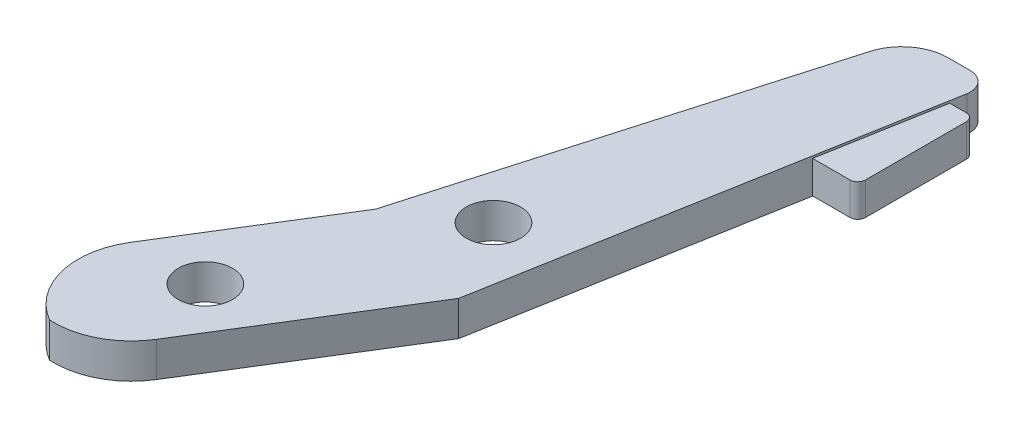
ISO-10303-21;
HEADER;
FILE_DESCRIPTION(('STEP AP214'),'2;1');
FILE_NAME('part.step','',(''),(''),'','','');
FILE_SCHEMA(('AUTOMOTIVE_DESIGN { 1 0 10303 214 1 1 1 1 }'));
ENDSEC;
DATA;
#1=APPLICATION_CONTEXT('core data for automotive mechanical design processes');
#2=APPLICATION_PROTOCOL_DEFINITION('international standard','automotive_design',2000,#1);
#3=PRODUCT_CONTEXT('',#1,'mechanical');
#4=PRODUCT('Part','Part','',(#3));
#5=PRODUCT_RELATED_PRODUCT_CATEGORY('part','',(#4));
#6=PRODUCT_DEFINITION_FORMATION('','',#4);
#7=PRODUCT_DEFINITION_CONTEXT('part definition',#1,'design');
#8=PRODUCT_DEFINITION('design','',#6,#7);
#9=PRODUCT_DEFINITION_SHAPE('','',#8);
#10=(LENGTH_UNIT() NAMED_UNIT(*) SI_UNIT(.MILLI.,.METRE.));
#11=(NAMED_UNIT(*) PLANE_ANGLE_UNIT() SI_UNIT($,.RADIAN.));
#12=(NAMED_UNIT(*) SI_UNIT($,.STERADIAN.) SOLID_ANGLE_UNIT());
#13=UNCERTAINTY_MEASURE_WITH_UNIT(LENGTH_MEASURE(1.E-05),#10,'distance_accuracy_value','');
#14=(GEOMETRIC_REPRESENTATION_CONTEXT(3) GLOBAL_UNCERTAINTY_ASSIGNED_CONTEXT((#13)) GLOBAL_UNIT_ASSIGNED_CONTEXT((#10,
#11,#12)) REPRESENTATION_CONTEXT('',''));
#15=CARTESIAN_POINT('',(0.,0.,0.));
#16=DIRECTION('',(0.,0.,1.));
#17=DIRECTION('',(1.,0.,0.));
#18=AXIS2_PLACEMENT_3D('',#15,#16,#17);
#19=CARTESIAN_POINT('',(17.140904696747,2.25,-12.9920484404567));
#20=DIRECTION('',(-0.85003009663462,0.,-0.526734121559767));
#21=DIRECTION('',(-0.526734121559767,0.,0.85003009663462));
#22=AXIS2_PLACEMENT_3D('',#19,#20,#21);
#23=PLANE('',#22);
#24=DIRECTION('',(0.526734121559767,0.,-0.85003009663462));
#25=VECTOR('',#24,1.);
#26=CARTESIAN_POINT('',(17.140904696747,2.25,-12.9920484404567));
#27=LINE('',#26,#25);
#28=CARTESIAN_POINT('',(9.68009535494014,2.25,-0.951984533055313));
#29=VERTEX_POINT('',#28);
#30=CARTESIAN_POINT('',(17.140904696747,2.25,-12.9920484404567));
#31=VERTEX_POINT('',#30);
#32=EDGE_CURVE('E182',#29,#31,#27,.T.);
#33=ORIENTED_EDGE('',*,*,#32,.F.);
#34=DIRECTION('',(0.,-1.,0.));
#35=VECTOR('',#34,1.);
#36=CARTESIAN_POINT('',(9.68009535494014,2.25,-0.951984533055313));
#37=LINE('',#36,#35);
#38=CARTESIAN_POINT('',(9.68009535494014,0.,-0.951984533055313));
#39=VERTEX_POINT('',#38);
#40=EDGE_CURVE('E212',#29,#39,#37,.T.);
#41=ORIENTED_EDGE('',*,*,#40,.T.);
#42=DIRECTION('',(0.526734121559767,0.,-0.85003009663462));
#43=VECTOR('',#42,1.);
#44=CARTESIAN_POINT('',(17.140904696747,0.,-12.9920484404567));
#45=LINE('',#44,#43);
#46=CARTESIAN_POINT('',(17.140904696747,0.,-12.9920484404567));
#47=VERTEX_POINT('',#46);
#48=EDGE_CURVE('E196',#39,#47,#45,.T.);
#49=ORIENTED_EDGE('',*,*,#48,.T.);
#50=DIRECTION('',(0.,-1.,0.));
#51=VECTOR('',#50,1.);
#52=CARTESIAN_POINT('',(17.140904696747,2.25,-12.9920484404567));
#53=LINE('',#52,#51);
#54=EDGE_CURVE('E209',#31,#47,#53,.T.);
#55=ORIENTED_EDGE('',*,*,#54,.F.);
#56=EDGE_LOOP('',(#33,#41,#49,#55));
#57=FACE_BOUND('',#56,.T.);
#58=ADVANCED_FACE('F33',(#57),#23,.F.);
#59=CARTESIAN_POINT('',(17.140904696747,2.25,-12.9920484404567));
#60=DIRECTION('',(-0.984486689305696,0.,-0.175459278979224));
#61=DIRECTION('',(-0.175459278979224,0.,0.984486689305697));
#62=AXIS2_PLACEMENT_3D('',#59,#60,#61);
#63=PLANE('',#62);
#64=DIRECTION('',(0.,-1.,0.));
#65=VECTOR('',#64,1.);
#66=CARTESIAN_POINT('',(20.5928074284273,2.1072170473523,-32.3603731702058));
#67=LINE('',#66,#65);
#68=CARTESIAN_POINT('',(20.5928074284273,2.1072170473523,-32.3603731702058));
#69=VERTEX_POINT('',#68);
#70=CARTESIAN_POINT('',(20.5928074284273,0.0072170473523008,-32.3603731702058));
#71=VERTEX_POINT('',#70);
#72=EDGE_CURVE('E143',#69,#71,#67,.T.);
#73=ORIENTED_EDGE('',*,*,#72,.F.);
#74=DIRECTION('',(-0.175459278979224,0.,0.984486689305697));
#75=VECTOR('',#74,1.);
#76=CARTESIAN_POINT('',(21.6672487151904,2.1072170473523,-38.3889693858783));
#77=LINE('',#76,#75);
#78=CARTESIAN_POINT('',(21.9294883674781,2.1072170473523,-39.8603731702058));
#79=VERTEX_POINT('',#78);
#80=EDGE_CURVE('E146',#79,#69,#77,.T.);
#81=ORIENTED_EDGE('',*,*,#80,.F.);
#82=DIRECTION('',(0.,1.,0.));
#83=VECTOR('',#82,1.);
#84=CARTESIAN_POINT('',(21.9294883674781,2.10721704735231,-39.8603731702058));
#85=LINE('',#84,#83);
#86=CARTESIAN_POINT('',(21.9294883674781,0.00721704735230167,-39.8603731702058));
#87=VERTEX_POINT('',#86);
#88=EDGE_CURVE('E166',#87,#79,#85,.T.);
#89=ORIENTED_EDGE('',*,*,#88,.F.);
#90=DIRECTION('',(0.175459278979224,0.,-0.984486689305697));
#91=VECTOR('',#90,1.);
#92=CARTESIAN_POINT('',(21.6672487151904,0.0072170473523015,-38.3889693858783));
#93=LINE('',#92,#91);
#94=EDGE_CURVE('E157',#71,#87,#93,.T.);
#95=ORIENTED_EDGE('',*,*,#94,.F.);
#96=EDGE_LOOP('',(#73,#81,#89,#95));
#97=FACE_BOUND('',#96,.T.);
#98=DIRECTION('',(0.175459278979224,0.,-0.984486689305696));
#99=VECTOR('',#98,1.);
#100=CARTESIAN_POINT('',(17.140904696747,0.,-12.9920484404567));
#101=LINE('',#100,#99);
#102=CARTESIAN_POINT('',(22.0960952188587,0.,-40.7951896614485));
#103=VERTEX_POINT('',#102);
#104=EDGE_CURVE('E198',#47,#103,#101,.T.);
#105=ORIENTED_EDGE('',*,*,#104,.T.);
#106=DIRECTION('',(0.,-1.,0.));
#107=VECTOR('',#106,1.);
#108=CARTESIAN_POINT('',(22.0960952188587,2.25,-40.7951896614485));
#109=LINE('',#108,#107);
#110=CARTESIAN_POINT('',(22.0960952188587,2.25,-40.7951896614485));
#111=VERTEX_POINT('',#110);
#112=EDGE_CURVE('E243',#103,#111,#109,.F.);
#113=ORIENTED_EDGE('',*,*,#112,.T.);
#114=DIRECTION('',(0.175459278979224,0.,-0.984486689305696));
#115=VECTOR('',#114,1.);
#116=CARTESIAN_POINT('',(17.140904696747,2.25,-12.9920484404567));
#117=LINE('',#116,#115);
#118=EDGE_CURVE('E184',#31,#111,#117,.T.);
#119=ORIENTED_EDGE('',*,*,#118,.F.);
#120=ORIENTED_EDGE('',*,*,#54,.T.);
#121=EDGE_LOOP('',(#105,#113,#119,#120));
#122=FACE_BOUND('',#121,.T.);
#123=ADVANCED_FACE('F155',(#97,#122),#63,.F.);
#124=CARTESIAN_POINT('',(22.3474894609134,2.25,-42.2057407962235));
#125=DIRECTION('',(0.,0.,1.));
#126=DIRECTION('',(1.,0.,0.));
#127=AXIS2_PLACEMENT_3D('',#124,#125,#126);
#128=PLANE('',#127);
#129=DIRECTION('',(-1.,0.,0.));
#130=VECTOR('',#129,1.);
#131=CARTESIAN_POINT('',(22.3474894609134,2.25,-42.2057407962235));
#132=LINE('',#131,#130);
#133=CARTESIAN_POINT('',(20.9147111916919,2.25,-42.2057407962235));
#134=VERTEX_POINT('',#133);
#135=CARTESIAN_POINT('',(19.4918794899271,2.25,-42.2057407962235));
#136=VERTEX_POINT('',#135);
#137=EDGE_CURVE('E188',#134,#136,#132,.T.);
#138=ORIENTED_EDGE('',*,*,#137,.F.);
#139=DIRECTION('',(0.,-1.,0.));
#140=VECTOR('',#139,1.);
#141=CARTESIAN_POINT('',(20.9147111916919,2.25,-42.2057407962235));
#142=LINE('',#141,#140);
#143=CARTESIAN_POINT('',(20.9147111916919,0.,-42.2057407962235));
#144=VERTEX_POINT('',#143);
#145=EDGE_CURVE('E238',#134,#144,#142,.T.);
#146=ORIENTED_EDGE('',*,*,#145,.T.);
#147=DIRECTION('',(-1.,0.,0.));
#148=VECTOR('',#147,1.);
#149=CARTESIAN_POINT('',(22.3474894609134,0.,-42.2057407962235));
#150=LINE('',#149,#148);
#151=CARTESIAN_POINT('',(19.4918794899271,0.,-42.2057407962235));
#152=VERTEX_POINT('',#151);
#153=EDGE_CURVE('E201',#144,#152,#150,.T.);
#154=ORIENTED_EDGE('',*,*,#153,.T.);
#155=DIRECTION('',(0.,-1.,0.));
#156=VECTOR('',#155,1.);
#157=CARTESIAN_POINT('',(19.4918794899271,2.25,-42.2057407962235));
#158=LINE('',#157,#156);
#159=EDGE_CURVE('E233',#152,#136,#158,.F.);
#160=ORIENTED_EDGE('',*,*,#159,.T.);
#161=EDGE_LOOP('',(#138,#146,#154,#160));
#162=FACE_BOUND('',#161,.T.);
#163=ADVANCED_FACE('F289',(#162),#128,.F.);
#164=CARTESIAN_POINT('',(9.48121418807581,2.25,-15.3005417394231));
#165=DIRECTION('',(0.960899966314299,0.,0.276895747055058));
#166=DIRECTION('',(0.276895747055058,0.,-0.960899966314299));
#167=AXIS2_PLACEMENT_3D('',#164,#165,#166);
#168=PLANE('',#167);
#169=DIRECTION('',(-0.276895747055058,0.,0.960899966314299));
#170=VECTOR('',#169,1.);
#171=CARTESIAN_POINT('',(9.48121418807581,2.25,-15.3005417394231));
#172=LINE('',#171,#170);
#173=CARTESIAN_POINT('',(16.6091795909842,2.25,-40.0364280373887));
#174=VERTEX_POINT('',#173);
#175=CARTESIAN_POINT('',(9.48121418807581,2.25,-15.3005417394231));
#176=VERTEX_POINT('',#175);
#177=EDGE_CURVE('E190',#174,#176,#172,.T.);
#178=ORIENTED_EDGE('',*,*,#177,.F.);
#179=DIRECTION('',(0.,-1.,0.));
#180=VECTOR('',#179,1.);
#181=CARTESIAN_POINT('',(16.6091795909842,2.25,-40.0364280373887));
#182=LINE('',#181,#180);
#183=CARTESIAN_POINT('',(16.6091795909842,0.,-40.0364280373887));
#184=VERTEX_POINT('',#183);
#185=EDGE_CURVE('E225',#174,#184,#182,.T.);
#186=ORIENTED_EDGE('',*,*,#185,.T.);
#187=DIRECTION('',(-0.276895747055058,0.,0.960899966314299));
#188=VECTOR('',#187,1.);
#189=CARTESIAN_POINT('',(9.48121418807581,0.,-15.3005417394231));
#190=LINE('',#189,#188);
#191=CARTESIAN_POINT('',(9.48121418807581,0.,-15.3005417394231));
#192=VERTEX_POINT('',#191);
#193=EDGE_CURVE('E203',#184,#192,#190,.T.);
#194=ORIENTED_EDGE('',*,*,#193,.T.);
#195=DIRECTION('',(0.,-1.,0.));
#196=VECTOR('',#195,1.);
#197=CARTESIAN_POINT('',(9.48121418807581,2.25,-15.3005417394231));
#198=LINE('',#197,#196);
#199=EDGE_CURVE('E195',#176,#192,#198,.T.);
#200=ORIENTED_EDGE('',*,*,#199,.F.);
#201=EDGE_LOOP('',(#178,#186,#194,#200));
#202=FACE_BOUND('',#201,.T.);
#203=ADVANCED_FACE('F327',(#202),#168,.F.);
#204=CARTESIAN_POINT('',(0.,2.25,0.));
#205=DIRECTION('',(0.850030096634619,0.,0.526734121559767));
#206=DIRECTION('',(0.526734121559767,0.,-0.850030096634619));
#207=AXIS2_PLACEMENT_3D('',#204,#205,#206);
#208=PLANE('',#207);
#209=DIRECTION('',(-0.526734121559767,0.,0.850030096634619));
#210=VECTOR('',#209,1.);
#211=CARTESIAN_POINT('',(0.,0.,0.));
#212=LINE('',#211,#210);
#213=CARTESIAN_POINT('',(3.43308465290625,0.,-5.54022448863435));
#214=VERTEX_POINT('',#213);
#215=EDGE_CURVE('E185',#192,#214,#212,.T.);
#216=ORIENTED_EDGE('',*,*,#215,.T.);
#217=DIRECTION('',(0.,-1.,0.));
#218=VECTOR('',#217,1.);
#219=CARTESIAN_POINT('',(3.43308465290625,2.25,-5.54022448863435));
#220=LINE('',#219,#218);
#221=CARTESIAN_POINT('',(3.43308465290625,2.25,-5.54022448863435));
#222=VERTEX_POINT('',#221);
#223=EDGE_CURVE('E223',#214,#222,#220,.F.);
#224=ORIENTED_EDGE('',*,*,#223,.T.);
#225=DIRECTION('',(-0.526734121559767,0.,0.850030096634619));
#226=VECTOR('',#225,1.);
#227=CARTESIAN_POINT('',(0.,2.25,0.));
#228=LINE('',#227,#226);
#229=EDGE_CURVE('E192',#176,#222,#228,.T.);
#230=ORIENTED_EDGE('',*,*,#229,.F.);
#231=ORIENTED_EDGE('',*,*,#199,.T.);
#232=EDGE_LOOP('',(#216,#224,#230,#231));
#233=FACE_BOUND('',#232,.T.);
#234=ADVANCED_FACE('F332',(#233),#208,.F.);
#235=CARTESIAN_POINT('',(0.,2.25,0.));
#236=DIRECTION('',(0.,-1.,0.));
#237=DIRECTION('',(0.,0.,-1.));
#238=AXIS2_PLACEMENT_3D('',#235,#236,#237);
#239=PLANE('',#238);
#240=CARTESIAN_POINT('',(8.16721187147033,2.25,-5.62987306447002));
#241=DIRECTION('',(0.,1.,0.));
#242=DIRECTION('',(0.,0.,1.));
#243=AXIS2_PLACEMENT_3D('',#240,#241,#242);
#244=CIRCLE('',#243,1.75);
#245=CARTESIAN_POINT('',(8.16721187147033,2.25,-3.87987306447002));
#246=VERTEX_POINT('',#245);
#247=EDGE_CURVE('E174',#246,#246,#244,.T.);
#248=ORIENTED_EDGE('',*,*,#247,.F.);
#249=EDGE_LOOP('',(#248));
#250=FACE_BOUND('',#249,.T.);
#251=CARTESIAN_POINT('',(14.0314518235541,2.25,-18.3424923769636));
#252=DIRECTION('',(0.,1.,0.));
#253=DIRECTION('',(0.,0.,1.));
#254=AXIS2_PLACEMENT_3D('',#251,#252,#253);
#255=CIRCLE('',#254,1.75);
#256=CARTESIAN_POINT('',(14.0314518235541,2.25,-16.5924923769636));
#257=VERTEX_POINT('',#256);
#258=EDGE_CURVE('E169',#257,#257,#255,.T.);
#259=ORIENTED_EDGE('',*,*,#258,.F.);
#260=EDGE_LOOP('',(#259));
#261=FACE_BOUND('',#260,.T.);
#262=ORIENTED_EDGE('',*,*,#118,.T.);
#263=CARTESIAN_POINT('',(20.9147111916919,2.25,-41.0057407962235));
#264=DIRECTION('',(0.,-1.,0.));
#265=DIRECTION('',(0.,0.,-1.));
#266=AXIS2_PLACEMENT_3D('',#263,#264,#265);
#267=CIRCLE('',#266,1.2);
#268=EDGE_CURVE('E245',#111,#134,#267,.F.);
#269=ORIENTED_EDGE('',*,*,#268,.T.);
#270=ORIENTED_EDGE('',*,*,#137,.T.);
#271=CARTESIAN_POINT('',(19.4918794899271,2.25,-39.2057407962235));
#272=DIRECTION('',(0.,-1.,0.));
#273=DIRECTION('',(0.,0.,-1.));
#274=AXIS2_PLACEMENT_3D('',#271,#272,#273);
#275=CIRCLE('',#274,3.);
#276=EDGE_CURVE('E236',#136,#174,#275,.F.);
#277=ORIENTED_EDGE('',*,*,#276,.T.);
#278=ORIENTED_EDGE('',*,*,#177,.T.);
#279=ORIENTED_EDGE('',*,*,#229,.T.);
#280=CARTESIAN_POINT('',(7.68323513607934,2.25,-2.90655388083552));
#281=DIRECTION('',(0.,-1.,0.));
#282=DIRECTION('',(0.,0.,-1.));
#283=AXIS2_PLACEMENT_3D('',#280,#281,#282);
#284=CIRCLE('',#283,5.);
#285=CARTESIAN_POINT('',(5.15430572660444,2.25,1.40674138402787));
#286=VERTEX_POINT('',#285);
#287=EDGE_CURVE('E219',#222,#286,#284,.F.);
#288=ORIENTED_EDGE('',*,*,#287,.T.);
#289=CARTESIAN_POINT('',(5.42994487176705,2.25,-3.58565514085415));
#290=DIRECTION('',(0.,-1.,0.));
#291=DIRECTION('',(0.,0.,-1.));
#292=AXIS2_PLACEMENT_3D('',#289,#290,#291);
#293=CIRCLE('',#292,5.);
#294=EDGE_CURVE('E221',#286,#29,#293,.F.);
#295=ORIENTED_EDGE('',*,*,#294,.T.);
#296=ORIENTED_EDGE('',*,*,#32,.T.);
#297=EDGE_LOOP('',(#262,#269,#270,#277,#278,#279,#288,#295,#296));
#298=FACE_BOUND('',#297,.T.);
#299=ADVANCED_FACE('F317',(#250,#261,#298),#239,.F.);
#300=CARTESIAN_POINT('',(0.,0.,0.));
#301=DIRECTION('',(0.,-1.,0.));
#302=DIRECTION('',(0.,0.,-1.));
#303=AXIS2_PLACEMENT_3D('',#300,#301,#302);
#304=PLANE('',#303);
#305=CARTESIAN_POINT('',(8.16721187147033,0.,-5.62987306447002));
#306=DIRECTION('',(0.,1.,0.));
#307=DIRECTION('',(0.,0.,1.));
#308=AXIS2_PLACEMENT_3D('',#305,#306,#307);
#309=CIRCLE('',#308,1.75);
#310=CARTESIAN_POINT('',(8.16721187147033,0.,-3.87987306447002));
#311=VERTEX_POINT('',#310);
#312=EDGE_CURVE('E170',#311,#311,#309,.T.);
#313=ORIENTED_EDGE('',*,*,#312,.T.);
#314=EDGE_LOOP('',(#313));
#315=FACE_BOUND('',#314,.T.);
#316=CARTESIAN_POINT('',(14.0314518235541,0.,-18.3424923769636));
#317=DIRECTION('',(0.,1.,0.));
#318=DIRECTION('',(0.,0.,1.));
#319=AXIS2_PLACEMENT_3D('',#316,#317,#318);
#320=CIRCLE('',#319,1.75);
#321=CARTESIAN_POINT('',(14.0314518235541,0.,-16.5924923769636));
#322=VERTEX_POINT('',#321);
#323=EDGE_CURVE('E177',#322,#322,#320,.T.);
#324=ORIENTED_EDGE('',*,*,#323,.T.);
#325=EDGE_LOOP('',(#324));
#326=FACE_BOUND('',#325,.T.);
#327=ORIENTED_EDGE('',*,*,#153,.F.);
#328=CARTESIAN_POINT('',(20.9147111916919,0.,-41.0057407962235));
#329=DIRECTION('',(0.,-1.,0.));
#330=DIRECTION('',(0.,0.,-1.));
#331=AXIS2_PLACEMENT_3D('',#328,#329,#330);
#332=CIRCLE('',#331,1.2);
#333=EDGE_CURVE('E241',#144,#103,#332,.T.);
#334=ORIENTED_EDGE('',*,*,#333,.T.);
#335=ORIENTED_EDGE('',*,*,#104,.F.);
#336=ORIENTED_EDGE('',*,*,#48,.F.);
#337=CARTESIAN_POINT('',(5.42994487176705,0.,-3.58565514085415));
#338=DIRECTION('',(0.,-1.,0.));
#339=DIRECTION('',(0.,0.,-1.));
#340=AXIS2_PLACEMENT_3D('',#337,#338,#339);
#341=CIRCLE('',#340,5.);
#342=CARTESIAN_POINT('',(5.15430572660444,0.,1.40674138402787));
#343=VERTEX_POINT('',#342);
#344=EDGE_CURVE('E217',#39,#343,#341,.T.);
#345=ORIENTED_EDGE('',*,*,#344,.T.);
#346=CARTESIAN_POINT('',(7.68323513607934,0.,-2.90655388083552));
#347=DIRECTION('',(0.,-1.,0.));
#348=DIRECTION('',(0.,0.,-1.));
#349=AXIS2_PLACEMENT_3D('',#346,#347,#348);
#350=CIRCLE('',#349,5.);
#351=EDGE_CURVE('E215',#343,#214,#350,.T.);
#352=ORIENTED_EDGE('',*,*,#351,.T.);
#353=ORIENTED_EDGE('',*,*,#215,.F.);
#354=ORIENTED_EDGE('',*,*,#193,.F.);
#355=CARTESIAN_POINT('',(19.4918794899271,0.,-39.2057407962235));
#356=DIRECTION('',(0.,-1.,0.));
#357=DIRECTION('',(0.,0.,-1.));
#358=AXIS2_PLACEMENT_3D('',#355,#356,#357);
#359=CIRCLE('',#358,3.);
#360=EDGE_CURVE('E230',#184,#152,#359,.T.);
#361=ORIENTED_EDGE('',*,*,#360,.T.);
#362=EDGE_LOOP('',(#327,#334,#335,#336,#345,#352,#353,#354,#361));
#363=FACE_BOUND('',#362,.T.);
#364=ADVANCED_FACE('F302',(#315,#326,#363),#304,.T.);
#365=CARTESIAN_POINT('',(7.68323513607934,2.25,-2.90655388083552));
#366=DIRECTION('',(0.,-1.,0.));
#367=DIRECTION('',(0.,0.,-1.));
#368=AXIS2_PLACEMENT_3D('',#365,#366,#367);
#369=CYLINDRICAL_SURFACE('',#368,5.);
#370=DIRECTION('',(0.,-1.,0.));
#371=VECTOR('',#370,1.);
#372=CARTESIAN_POINT('',(5.15430572660444,1.125,1.40674138402787));
#373=LINE('',#372,#371);
#374=EDGE_CURVE('E173',#286,#343,#373,.T.);
#375=ORIENTED_EDGE('',*,*,#374,.F.);
#376=ORIENTED_EDGE('',*,*,#287,.F.);
#377=ORIENTED_EDGE('',*,*,#223,.F.);
#378=ORIENTED_EDGE('',*,*,#351,.F.);
#379=EDGE_LOOP('',(#375,#376,#377,#378));
#380=FACE_BOUND('',#379,.T.);
#381=ADVANCED_FACE('F298',(#380),#369,.T.);
#382=CARTESIAN_POINT('',(5.42994487176705,2.25,-3.58565514085415));
#383=DIRECTION('',(0.,-1.,0.));
#384=DIRECTION('',(0.,0.,-1.));
#385=AXIS2_PLACEMENT_3D('',#382,#383,#384);
#386=CYLINDRICAL_SURFACE('',#385,5.);
#387=ORIENTED_EDGE('',*,*,#294,.F.);
#388=ORIENTED_EDGE('',*,*,#374,.T.);
#389=ORIENTED_EDGE('',*,*,#344,.F.);
#390=ORIENTED_EDGE('',*,*,#40,.F.);
#391=EDGE_LOOP('',(#387,#388,#389,#390));
#392=FACE_BOUND('',#391,.T.);
#393=ADVANCED_FACE('F294',(#392),#386,.T.);
#394=CARTESIAN_POINT('',(14.0314518235541,0.,-18.3424923769636));
#395=DIRECTION('',(0.,1.,0.));
#396=DIRECTION('',(0.,0.,1.));
#397=AXIS2_PLACEMENT_3D('',#394,#395,#396);
#398=CYLINDRICAL_SURFACE('',#397,1.75);
#399=ORIENTED_EDGE('',*,*,#323,.F.);
#400=EDGE_LOOP('',(#399));
#401=FACE_BOUND('',#400,.T.);
#402=ORIENTED_EDGE('',*,*,#258,.T.);
#403=EDGE_LOOP('',(#402));
#404=FACE_BOUND('',#403,.T.);
#405=ADVANCED_FACE('F297',(#401,#404),#398,.F.);
#406=CARTESIAN_POINT('',(8.16721187147033,0.,-5.62987306447002));
#407=DIRECTION('',(0.,1.,0.));
#408=DIRECTION('',(0.,0.,1.));
#409=AXIS2_PLACEMENT_3D('',#406,#407,#408);
#410=CYLINDRICAL_SURFACE('',#409,1.75);
#411=ORIENTED_EDGE('',*,*,#312,.F.);
#412=EDGE_LOOP('',(#411));
#413=FACE_BOUND('',#412,.T.);
#414=ORIENTED_EDGE('',*,*,#247,.T.);
#415=EDGE_LOOP('',(#414));
#416=FACE_BOUND('',#415,.T.);
#417=ADVANCED_FACE('F397',(#413,#416),#410,.F.);
#418=CARTESIAN_POINT('',(23.5,0.,0.));
#419=DIRECTION('',(-1.,0.,0.));
#420=DIRECTION('',(0.,0.,1.));
#421=AXIS2_PLACEMENT_3D('',#418,#419,#420);
#422=PLANE('',#421);
#423=DIRECTION('',(0.,0.,1.));
#424=VECTOR('',#423,1.);
#425=CARTESIAN_POINT('',(23.5,2.1072170473523,-39.8603731702058));
#426=LINE('',#425,#424);
#427=CARTESIAN_POINT('',(23.5,2.1072170473523,-39.3603731702058));
#428=VERTEX_POINT('',#427);
#429=CARTESIAN_POINT('',(23.5,2.1072170473523,-32.8603731702058));
#430=VERTEX_POINT('',#429);
#431=EDGE_CURVE('E259',#428,#430,#426,.T.);
#432=ORIENTED_EDGE('',*,*,#431,.T.);
#433=DIRECTION('',(0.,-1.,0.));
#434=VECTOR('',#433,1.);
#435=CARTESIAN_POINT('',(23.5,0.0072170473523008,-32.8603731702058));
#436=LINE('',#435,#434);
#437=CARTESIAN_POINT('',(23.5,0.00721704735230086,-32.8603731702058));
#438=VERTEX_POINT('',#437);
#439=EDGE_CURVE('E250',#430,#438,#436,.T.);
#440=ORIENTED_EDGE('',*,*,#439,.T.);
#441=DIRECTION('',(0.,0.,-1.));
#442=VECTOR('',#441,1.);
#443=CARTESIAN_POINT('',(23.5,0.00721704735230167,-39.8603731702058));
#444=LINE('',#443,#442);
#445=CARTESIAN_POINT('',(23.5,0.00721704735230161,-39.3603731702058));
#446=VERTEX_POINT('',#445);
#447=EDGE_CURVE('E153',#438,#446,#444,.T.);
#448=ORIENTED_EDGE('',*,*,#447,.T.);
#449=DIRECTION('',(0.,1.,0.));
#450=VECTOR('',#449,1.);
#451=CARTESIAN_POINT('',(23.5,2.1072170473523,-39.3603731702058));
#452=LINE('',#451,#450);
#453=EDGE_CURVE('E247',#446,#428,#452,.T.);
#454=ORIENTED_EDGE('',*,*,#453,.T.);
#455=EDGE_LOOP('',(#432,#440,#448,#454));
#456=FACE_BOUND('',#455,.T.);
#457=ADVANCED_FACE('F263',(#456),#422,.F.);
#458=CARTESIAN_POINT('',(13.4113305973691,2.1072170473523,-39.8603731702058));
#459=DIRECTION('',(0.,1.,0.));
#460=DIRECTION('',(0.,0.,1.));
#461=AXIS2_PLACEMENT_3D('',#458,#459,#460);
#462=PLANE('',#461);
#463=DIRECTION('',(1.,0.,0.));
#464=VECTOR('',#463,1.);
#465=CARTESIAN_POINT('',(13.4113305973691,2.1072170473523,-32.3603731702058));
#466=LINE('',#465,#464);
#467=CARTESIAN_POINT('',(23.,2.1072170473523,-32.3603731702058));
#468=VERTEX_POINT('',#467);
#469=EDGE_CURVE('E139',#69,#468,#466,.T.);
#470=ORIENTED_EDGE('',*,*,#469,.T.);
#471=CARTESIAN_POINT('',(23.,2.1072170473523,-32.8603731702058));
#472=DIRECTION('',(0.,1.,0.));
#473=DIRECTION('',(0.,0.,1.));
#474=AXIS2_PLACEMENT_3D('',#471,#472,#473);
#475=CIRCLE('',#474,0.5);
#476=EDGE_CURVE('E41',#468,#430,#475,.T.);
#477=ORIENTED_EDGE('',*,*,#476,.T.);
#478=ORIENTED_EDGE('',*,*,#431,.F.);
#479=CARTESIAN_POINT('',(23.,2.1072170473523,-39.3603731702058));
#480=DIRECTION('',(0.,1.,0.));
#481=DIRECTION('',(0.,0.,1.));
#482=AXIS2_PLACEMENT_3D('',#479,#480,#481);
#483=CIRCLE('',#482,0.5);
#484=CARTESIAN_POINT('',(23.,2.1072170473523,-39.8603731702058));
#485=VERTEX_POINT('',#484);
#486=EDGE_CURVE('E48',#428,#485,#483,.T.);
#487=ORIENTED_EDGE('',*,*,#486,.T.);
#488=DIRECTION('',(1.,0.,0.));
#489=VECTOR('',#488,1.);
#490=CARTESIAN_POINT('',(13.4113305973691,2.1072170473523,-39.8603731702058));
#491=LINE('',#490,#489);
#492=EDGE_CURVE('E150',#79,#485,#491,.T.);
#493=ORIENTED_EDGE('',*,*,#492,.F.);
#494=ORIENTED_EDGE('',*,*,#80,.T.);
#495=EDGE_LOOP('',(#470,#477,#478,#487,#493,#494));
#496=FACE_BOUND('',#495,.T.);
#497=ADVANCED_FACE('F149',(#496),#462,.T.);
#498=CARTESIAN_POINT('',(13.4113305973691,2.1072170473523,-32.3603731702058));
#499=DIRECTION('',(0.,0.,1.));
#500=DIRECTION('',(1.,0.,0.));
#501=AXIS2_PLACEMENT_3D('',#498,#499,#500);
#502=PLANE('',#501);
#503=DIRECTION('',(1.,0.,0.));
#504=VECTOR('',#503,1.);
#505=CARTESIAN_POINT('',(13.4113305973691,0.0072170473523008,-32.3603731702058));
#506=LINE('',#505,#504);
#507=CARTESIAN_POINT('',(23.,0.0072170473523008,-32.3603731702058));
#508=VERTEX_POINT('',#507);
#509=EDGE_CURVE('E158',#71,#508,#506,.T.);
#510=ORIENTED_EDGE('',*,*,#509,.T.);
#511=DIRECTION('',(0.,-1.,0.));
#512=VECTOR('',#511,1.);
#513=CARTESIAN_POINT('',(23.,2.1072170473523,-32.3603731702058));
#514=LINE('',#513,#512);
#515=EDGE_CURVE('E56',#508,#468,#514,.F.);
#516=ORIENTED_EDGE('',*,*,#515,.T.);
#517=ORIENTED_EDGE('',*,*,#469,.F.);
#518=ORIENTED_EDGE('',*,*,#72,.T.);
#519=EDGE_LOOP('',(#510,#516,#517,#518));
#520=FACE_BOUND('',#519,.T.);
#521=ADVANCED_FACE('F141',(#520),#502,.T.);
#522=CARTESIAN_POINT('',(13.4113305973691,0.00721704735230167,-39.8603731702058));
#523=DIRECTION('',(0.,-1.,0.));
#524=DIRECTION('',(0.,0.,-1.));
#525=AXIS2_PLACEMENT_3D('',#522,#523,#524);
#526=PLANE('',#525);
#527=ORIENTED_EDGE('',*,*,#447,.F.);
#528=CARTESIAN_POINT('',(23.,0.00721704735230086,-32.8603731702058));
#529=DIRECTION('',(0.,-1.,0.));
#530=DIRECTION('',(0.,0.,-1.));
#531=AXIS2_PLACEMENT_3D('',#528,#529,#530);
#532=CIRCLE('',#531,0.5);
#533=EDGE_CURVE('E255',#438,#508,#532,.T.);
#534=ORIENTED_EDGE('',*,*,#533,.T.);
#535=ORIENTED_EDGE('',*,*,#509,.F.);
#536=ORIENTED_EDGE('',*,*,#94,.T.);
#537=DIRECTION('',(1.,0.,0.));
#538=VECTOR('',#537,1.);
#539=CARTESIAN_POINT('',(13.4113305973691,0.00721704735230167,-39.8603731702058));
#540=LINE('',#539,#538);
#541=CARTESIAN_POINT('',(23.,0.00721704735230167,-39.8603731702058));
#542=VERTEX_POINT('',#541);
#543=EDGE_CURVE('E164',#87,#542,#540,.T.);
#544=ORIENTED_EDGE('',*,*,#543,.T.);
#545=CARTESIAN_POINT('',(23.,0.00721704735230161,-39.3603731702058));
#546=DIRECTION('',(0.,-1.,0.));
#547=DIRECTION('',(0.,0.,-1.));
#548=AXIS2_PLACEMENT_3D('',#545,#546,#547);
#549=CIRCLE('',#548,0.5);
#550=EDGE_CURVE('E253',#542,#446,#549,.T.);
#551=ORIENTED_EDGE('',*,*,#550,.T.);
#552=EDGE_LOOP('',(#527,#534,#535,#536,#544,#551));
#553=FACE_BOUND('',#552,.T.);
#554=ADVANCED_FACE('F270',(#553),#526,.T.);
#555=CARTESIAN_POINT('',(13.4113305973691,2.1072170473523,-39.8603731702058));
#556=DIRECTION('',(0.,0.,-1.));
#557=DIRECTION('',(0.,1.,0.));
#558=AXIS2_PLACEMENT_3D('',#555,#556,#557);
#559=PLANE('',#558);
#560=ORIENTED_EDGE('',*,*,#492,.T.);
#561=DIRECTION('',(0.,1.,0.));
#562=VECTOR('',#561,1.);
#563=CARTESIAN_POINT('',(23.,0.00721704735230167,-39.8603731702058));
#564=LINE('',#563,#562);
#565=EDGE_CURVE('E11',#485,#542,#564,.F.);
#566=ORIENTED_EDGE('',*,*,#565,.T.);
#567=ORIENTED_EDGE('',*,*,#543,.F.);
#568=ORIENTED_EDGE('',*,*,#88,.T.);
#569=EDGE_LOOP('',(#560,#566,#567,#568));
#570=FACE_BOUND('',#569,.T.);
#571=ADVANCED_FACE('F275',(#570),#559,.T.);
#572=CARTESIAN_POINT('',(19.4918794899271,2.25,-39.2057407962235));
#573=DIRECTION('',(0.,-1.,0.));
#574=DIRECTION('',(0.,0.,-1.));
#575=AXIS2_PLACEMENT_3D('',#572,#573,#574);
#576=CYLINDRICAL_SURFACE('',#575,3.);
#577=ORIENTED_EDGE('',*,*,#276,.F.);
#578=ORIENTED_EDGE('',*,*,#159,.F.);
#579=ORIENTED_EDGE('',*,*,#360,.F.);
#580=ORIENTED_EDGE('',*,*,#185,.F.);
#581=EDGE_LOOP('',(#577,#578,#579,#580));
#582=FACE_BOUND('',#581,.T.);
#583=ADVANCED_FACE('F304',(#582),#576,.T.);
#584=CARTESIAN_POINT('',(20.9147111916919,2.25,-41.0057407962235));
#585=DIRECTION('',(0.,-1.,0.));
#586=DIRECTION('',(0.,0.,-1.));
#587=AXIS2_PLACEMENT_3D('',#584,#585,#586);
#588=CYLINDRICAL_SURFACE('',#587,1.2);
#589=ORIENTED_EDGE('',*,*,#268,.F.);
#590=ORIENTED_EDGE('',*,*,#112,.F.);
#591=ORIENTED_EDGE('',*,*,#333,.F.);
#592=ORIENTED_EDGE('',*,*,#145,.F.);
#593=EDGE_LOOP('',(#589,#590,#591,#592));
#594=FACE_BOUND('',#593,.T.);
#595=ADVANCED_FACE('F282',(#594),#588,.T.);
#596=CARTESIAN_POINT('',(23.,0.,-32.8603731702058));
#597=DIRECTION('',(0.,1.,0.));
#598=DIRECTION('',(0.,0.,1.));
#599=AXIS2_PLACEMENT_3D('',#596,#597,#598);
#600=CYLINDRICAL_SURFACE('',#599,0.5);
#601=ORIENTED_EDGE('',*,*,#476,.F.);
#602=ORIENTED_EDGE('',*,*,#515,.F.);
#603=ORIENTED_EDGE('',*,*,#533,.F.);
#604=ORIENTED_EDGE('',*,*,#439,.F.);
#605=EDGE_LOOP('',(#601,#602,#603,#604));
#606=FACE_BOUND('',#605,.T.);
#607=ADVANCED_FACE('F268',(#606),#600,.T.);
#608=CARTESIAN_POINT('',(23.,2.60111860425004E-13,-39.3603731702058));
#609=DIRECTION('',(0.,-1.,0.));
#610=DIRECTION('',(0.,0.,-1.));
#611=AXIS2_PLACEMENT_3D('',#608,#609,#610);
#612=CYLINDRICAL_SURFACE('',#611,0.5);
#613=ORIENTED_EDGE('',*,*,#550,.F.);
#614=ORIENTED_EDGE('',*,*,#565,.F.);
#615=ORIENTED_EDGE('',*,*,#486,.F.);
#616=ORIENTED_EDGE('',*,*,#453,.F.);
#617=EDGE_LOOP('',(#613,#614,#615,#616));
#618=FACE_BOUND('',#617,.T.);
#619=ADVANCED_FACE('F35',(#618),#612,.T.);
#620=CLOSED_SHELL('',(#58,#123,#163,#203,#234,#299,#364,#381,#393,#405,#417,#457,#497,#521,#554,
#571,#583,#595,#607,#619));
#621=MANIFOLD_SOLID_BREP('B2',#620);
#622=ADVANCED_BREP_SHAPE_REPRESENTATION('',(#18,#621),#14);
#623=SHAPE_DEFINITION_REPRESENTATION(#9,#622);
ENDSEC;
END-ISO-10303-21;
